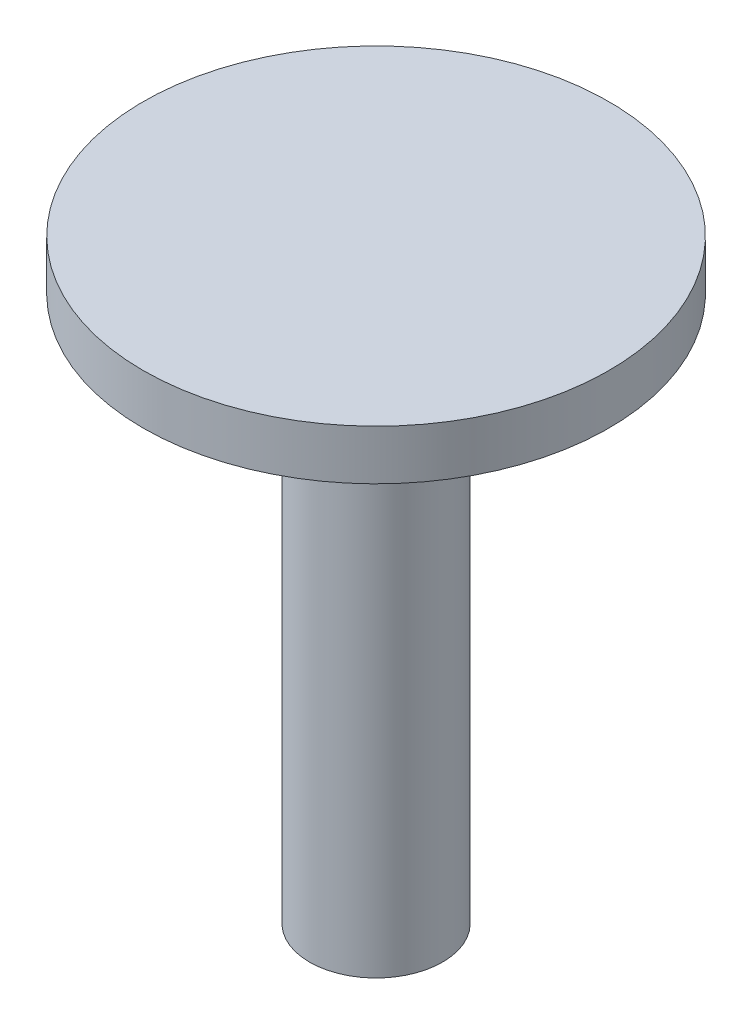
ISO-10303-21;
HEADER;
FILE_DESCRIPTION(('STEP AP214'),'2;1');
FILE_NAME('part.step','',(''),(''),'','','');
FILE_SCHEMA(('AUTOMOTIVE_DESIGN { 1 0 10303 214 1 1 1 1 }'));
ENDSEC;
DATA;
#1=APPLICATION_CONTEXT('core data for automotive mechanical design processes');
#2=APPLICATION_PROTOCOL_DEFINITION('international standard','automotive_design',2000,#1);
#3=PRODUCT_CONTEXT('',#1,'mechanical');
#4=PRODUCT('Part','Part','',(#3));
#5=PRODUCT_RELATED_PRODUCT_CATEGORY('part','',(#4));
#6=PRODUCT_DEFINITION_FORMATION('','',#4);
#7=PRODUCT_DEFINITION_CONTEXT('part definition',#1,'design');
#8=PRODUCT_DEFINITION('design','',#6,#7);
#9=PRODUCT_DEFINITION_SHAPE('','',#8);
#10=(LENGTH_UNIT() NAMED_UNIT(*) SI_UNIT(.MILLI.,.METRE.));
#11=(NAMED_UNIT(*) PLANE_ANGLE_UNIT() SI_UNIT($,.RADIAN.));
#12=(NAMED_UNIT(*) SI_UNIT($,.STERADIAN.) SOLID_ANGLE_UNIT());
#13=UNCERTAINTY_MEASURE_WITH_UNIT(LENGTH_MEASURE(1.E-05),#10,'distance_accuracy_value','');
#14=(GEOMETRIC_REPRESENTATION_CONTEXT(3) GLOBAL_UNCERTAINTY_ASSIGNED_CONTEXT((#13)) GLOBAL_UNIT_ASSIGNED_CONTEXT((#10,
#11,#12)) REPRESENTATION_CONTEXT('',''));
#15=CARTESIAN_POINT('',(0.,0.,0.));
#16=DIRECTION('',(0.,0.,1.));
#17=DIRECTION('',(1.,0.,0.));
#18=AXIS2_PLACEMENT_3D('',#15,#16,#17);
#19=CARTESIAN_POINT('',(0.,0.,0.));
#20=DIRECTION('',(0.,-1.,0.));
#21=DIRECTION('',(0.,0.,-1.));
#22=AXIS2_PLACEMENT_3D('',#19,#20,#21);
#23=PLANE('',#22);
#24=CARTESIAN_POINT('',(0.,0.,0.));
#25=DIRECTION('',(0.,1.,0.));
#26=DIRECTION('',(0.,0.,1.));
#27=AXIS2_PLACEMENT_3D('',#24,#25,#26);
#28=CIRCLE('',#27,4.);
#29=CARTESIAN_POINT('',(0.,0.,4.));
#30=VERTEX_POINT('',#29);
#31=EDGE_CURVE('E10',#30,#30,#28,.T.);
#32=ORIENTED_EDGE('',*,*,#31,.F.);
#33=EDGE_LOOP('',(#32));
#34=FACE_BOUND('',#33,.T.);
#35=ADVANCED_FACE('F35',(#34),#23,.T.);
#36=CARTESIAN_POINT('',(0.,0.,0.));
#37=DIRECTION('',(0.,1.,0.));
#38=DIRECTION('',(0.,0.,1.));
#39=AXIS2_PLACEMENT_3D('',#36,#37,#38);
#40=CYLINDRICAL_SURFACE('',#39,4.);
#41=ORIENTED_EDGE('',*,*,#31,.T.);
#42=EDGE_LOOP('',(#41));
#43=FACE_BOUND('',#42,.T.);
#44=CARTESIAN_POINT('',(0.,32.8,0.));
#45=DIRECTION('',(0.,1.,0.));
#46=DIRECTION('',(0.,0.,1.));
#47=AXIS2_PLACEMENT_3D('',#44,#45,#46);
#48=CIRCLE('',#47,4.);
#49=CARTESIAN_POINT('',(0.,32.8,4.));
#50=VERTEX_POINT('',#49);
#51=EDGE_CURVE('E41',#50,#50,#48,.T.);
#52=ORIENTED_EDGE('',*,*,#51,.F.);
#53=EDGE_LOOP('',(#52));
#54=FACE_BOUND('',#53,.T.);
#55=ADVANCED_FACE('F67',(#43,#54),#40,.T.);
#56=CARTESIAN_POINT('',(-4.,32.8,0.));
#57=DIRECTION('',(0.,-1.,0.));
#58=DIRECTION('',(0.,0.,-1.));
#59=AXIS2_PLACEMENT_3D('',#56,#57,#58);
#60=PLANE('',#59);
#61=ORIENTED_EDGE('',*,*,#51,.T.);
#62=EDGE_LOOP('',(#61));
#63=FACE_BOUND('',#62,.T.);
#64=CARTESIAN_POINT('',(0.,32.8,0.));
#65=DIRECTION('',(0.,1.,0.));
#66=DIRECTION('',(0.,0.,1.));
#67=AXIS2_PLACEMENT_3D('',#64,#65,#66);
#68=CIRCLE('',#67,14.);
#69=CARTESIAN_POINT('',(0.,32.8,14.));
#70=VERTEX_POINT('',#69);
#71=EDGE_CURVE('E45',#70,#70,#68,.T.);
#72=ORIENTED_EDGE('',*,*,#71,.F.);
#73=EDGE_LOOP('',(#72));
#74=FACE_BOUND('',#73,.T.);
#75=ADVANCED_FACE('F59',(#63,#74),#60,.T.);
#76=CARTESIAN_POINT('',(0.,0.,0.));
#77=DIRECTION('',(0.,1.,0.));
#78=DIRECTION('',(0.,0.,1.));
#79=AXIS2_PLACEMENT_3D('',#76,#77,#78);
#80=CYLINDRICAL_SURFACE('',#79,14.);
#81=ORIENTED_EDGE('',*,*,#71,.T.);
#82=EDGE_LOOP('',(#81));
#83=FACE_BOUND('',#82,.T.);
#84=CARTESIAN_POINT('',(0.,35.8,0.));
#85=DIRECTION('',(0.,1.,0.));
#86=DIRECTION('',(0.,0.,1.));
#87=AXIS2_PLACEMENT_3D('',#84,#85,#86);
#88=CIRCLE('',#87,14.);
#89=CARTESIAN_POINT('',(0.,35.8,14.));
#90=VERTEX_POINT('',#89);
#91=EDGE_CURVE('E49',#90,#90,#88,.T.);
#92=ORIENTED_EDGE('',*,*,#91,.F.);
#93=EDGE_LOOP('',(#92));
#94=FACE_BOUND('',#93,.T.);
#95=ADVANCED_FACE('F57',(#83,#94),#80,.T.);
#96=CARTESIAN_POINT('',(-14.,35.8,0.));
#97=DIRECTION('',(0.,1.,0.));
#98=DIRECTION('',(0.,0.,1.));
#99=AXIS2_PLACEMENT_3D('',#96,#97,#98);
#100=PLANE('',#99);
#101=ORIENTED_EDGE('',*,*,#91,.T.);
#102=EDGE_LOOP('',(#101));
#103=FACE_BOUND('',#102,.T.);
#104=ADVANCED_FACE('F55',(#103),#100,.T.);
#105=CLOSED_SHELL('',(#35,#55,#75,#95,#104));
#106=MANIFOLD_SOLID_BREP('B2',#105);
#107=ADVANCED_BREP_SHAPE_REPRESENTATION('',(#18,#106),#14);
#108=SHAPE_DEFINITION_REPRESENTATION(#9,#107);
ENDSEC;
END-ISO-10303-21;
